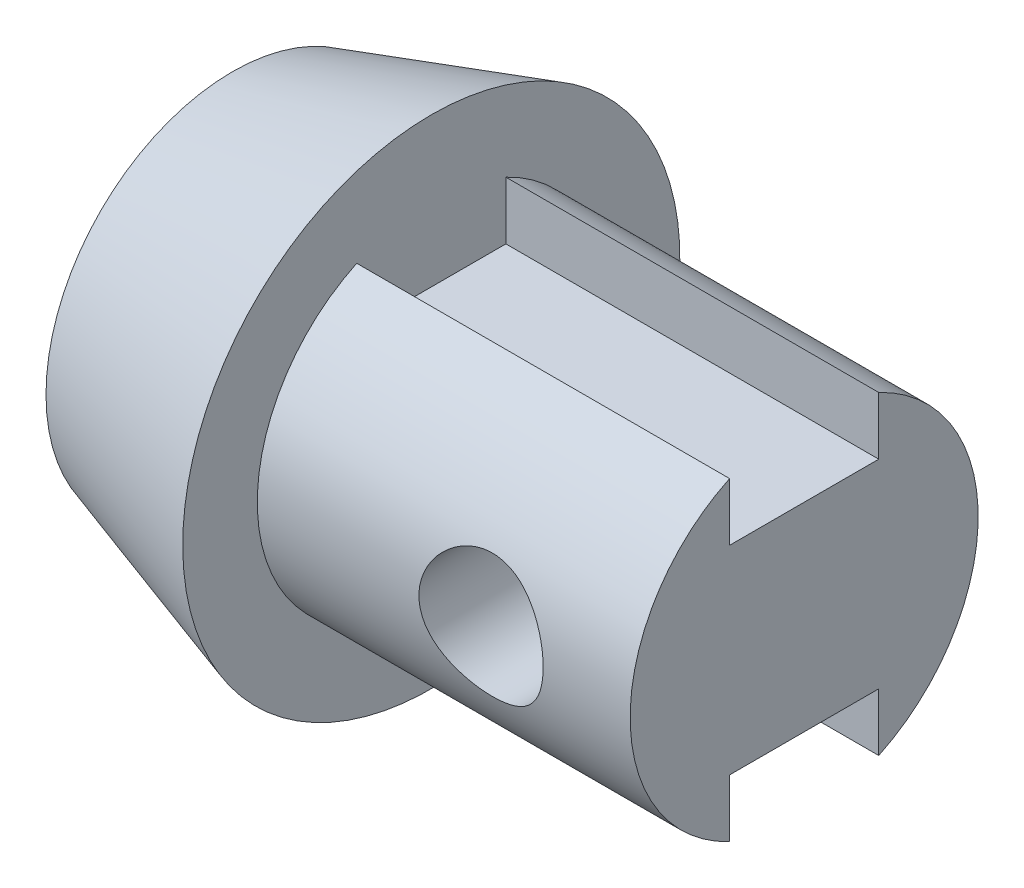
ISO-10303-21;
HEADER;
FILE_DESCRIPTION(('STEP AP214'),'2;1');
FILE_NAME('part.step','',(''),(''),'','','');
FILE_SCHEMA(('AUTOMOTIVE_DESIGN { 1 0 10303 214 1 1 1 1 }'));
ENDSEC;
DATA;
#1=APPLICATION_CONTEXT('core data for automotive mechanical design processes');
#2=APPLICATION_PROTOCOL_DEFINITION('international standard','automotive_design',2000,#1);
#3=PRODUCT_CONTEXT('',#1,'mechanical');
#4=PRODUCT('Part','Part','',(#3));
#5=PRODUCT_RELATED_PRODUCT_CATEGORY('part','',(#4));
#6=PRODUCT_DEFINITION_FORMATION('','',#4);
#7=PRODUCT_DEFINITION_CONTEXT('part definition',#1,'design');
#8=PRODUCT_DEFINITION('design','',#6,#7);
#9=PRODUCT_DEFINITION_SHAPE('','',#8);
#10=(LENGTH_UNIT() NAMED_UNIT(*) SI_UNIT(.MILLI.,.METRE.));
#11=(NAMED_UNIT(*) PLANE_ANGLE_UNIT() SI_UNIT($,.RADIAN.));
#12=(NAMED_UNIT(*) SI_UNIT($,.STERADIAN.) SOLID_ANGLE_UNIT());
#13=UNCERTAINTY_MEASURE_WITH_UNIT(LENGTH_MEASURE(1.E-05),#10,'distance_accuracy_value','');
#14=(GEOMETRIC_REPRESENTATION_CONTEXT(3) GLOBAL_UNCERTAINTY_ASSIGNED_CONTEXT((#13)) GLOBAL_UNIT_ASSIGNED_CONTEXT((#10,
#11,#12)) REPRESENTATION_CONTEXT('',''));
#15=CARTESIAN_POINT('',(0.,0.,0.));
#16=DIRECTION('',(0.,0.,1.));
#17=DIRECTION('',(1.,0.,0.));
#18=AXIS2_PLACEMENT_3D('',#15,#16,#17);
#19=CARTESIAN_POINT('',(23.,0.,0.));
#20=DIRECTION('',(1.,0.,0.));
#21=DIRECTION('',(0.,1.,0.));
#22=AXIS2_PLACEMENT_3D('',#19,#20,#21);
#23=CYLINDRICAL_SURFACE('',#22,7.);
#24=CARTESIAN_POINT('',(19.5,0.,-7.));
#25=CARTESIAN_POINT('',(19.5000028240419,-0.135839760518735,-7.0000020295295));
#26=CARTESIAN_POINT('',(19.4888932427672,-0.271659429947531,-6.99601056603649));
#27=CARTESIAN_POINT('',(19.4449087128079,-0.539264896606897,-6.98048404948616));
#28=CARTESIAN_POINT('',(19.4120345949352,-0.671050847614628,-6.96894928437749));
#29=CARTESIAN_POINT('',(19.3258148587325,-0.926692116674317,-6.93958109810981));
#30=CARTESIAN_POINT('',(19.2725064402801,-1.05056137145919,-6.92175912724346));
#31=CARTESIAN_POINT('',(19.1471112806324,-1.28759585298401,-6.88161078032354));
#32=CARTESIAN_POINT('',(19.075020040551,-1.40075850640075,-6.85928332539979));
#33=CARTESIAN_POINT('',(18.9111568678836,-1.61758802805346,-6.81147377429754));
#34=CARTESIAN_POINT('',(18.8187812689946,-1.72078015672851,-6.78590827445072));
#35=CARTESIAN_POINT('',(18.6182536362102,-1.9105819932243,-6.73493522536265));
#36=CARTESIAN_POINT('',(18.5100974162836,-1.99718728701346,-6.70952771990194));
#37=CARTESIAN_POINT('',(18.2766022072243,-2.15423735561842,-6.6608007016897));
#38=CARTESIAN_POINT('',(18.1508052564835,-2.2240352979483,-6.63758107761794));
#39=CARTESIAN_POINT('',(17.8882963352957,-2.34127572230003,-6.59714352451506));
#40=CARTESIAN_POINT('',(17.7515882854323,-2.38872619231546,-6.57992345154766));
#41=CARTESIAN_POINT('',(17.4765771637975,-2.45809130448528,-6.55432038222057));
#42=CARTESIAN_POINT('',(17.3385306930569,-2.48090519407331,-6.54562733379002));
#43=CARTESIAN_POINT('',(17.0603163681762,-2.5031615222748,-6.53715061879805));
#44=CARTESIAN_POINT('',(16.9201493074584,-2.50261249605974,-6.53736369856128));
#45=CARTESIAN_POINT('',(16.6496443449475,-2.4788507897233,-6.54640588297195));
#46=CARTESIAN_POINT('',(16.5191816470003,-2.45685161763648,-6.5547736366904));
#47=CARTESIAN_POINT('',(16.2639384728167,-2.3928085105506,-6.57842082174383));
#48=CARTESIAN_POINT('',(16.1391587753492,-2.35076183734614,-6.59370119723067));
#49=CARTESIAN_POINT('',(15.8962262542143,-2.247095668441,-6.62975170487814));
#50=CARTESIAN_POINT('',(15.7782303973415,-2.18514195933256,-6.65061447775042));
#51=CARTESIAN_POINT('',(15.5539436133503,-2.04365272690694,-6.69544469696369));
#52=CARTESIAN_POINT('',(15.4476564666926,-1.96411154980233,-6.71941314064672));
#53=CARTESIAN_POINT('',(15.2430404086289,-1.78403149047108,-6.76952498465894));
#54=CARTESIAN_POINT('',(15.1455821407508,-1.68251331515438,-6.79571223474351));
#55=CARTESIAN_POINT('',(14.9688283171652,-1.46426184534914,-6.84605473605516));
#56=CARTESIAN_POINT('',(14.8895350577012,-1.3475266301937,-6.87020973014028));
#57=CARTESIAN_POINT('',(14.7505193900608,-1.10010034292175,-6.91416998722002));
#58=CARTESIAN_POINT('',(14.6910617601102,-0.96924911242521,-6.93391532170415));
#59=CARTESIAN_POINT('',(14.5952841758396,-0.698523468127248,-6.96639167687355));
#60=CARTESIAN_POINT('',(14.5589549392374,-0.558652699053767,-6.97912551125635));
#61=CARTESIAN_POINT('',(14.5120808493404,-0.281205091813834,-6.99566202632136));
#62=CARTESIAN_POINT('',(14.5003618692543,-0.143850613169093,-6.99987103999093));
#63=CARTESIAN_POINT('',(14.4996548780098,0.130909371573393,-7.00012297890716));
#64=CARTESIAN_POINT('',(14.5106623730082,0.268314862212671,-6.99616751856457));
#65=CARTESIAN_POINT('',(14.5541861373216,0.534368698997769,-6.98080349995239));
#66=CARTESIAN_POINT('',(14.5859547557982,0.663155848081399,-6.96965417819419));
#67=CARTESIAN_POINT('',(14.6691365947361,0.913499444029994,-6.94128245796679));
#68=CARTESIAN_POINT('',(14.7205523658286,1.03505494970017,-6.9240592709991));
#69=CARTESIAN_POINT('',(14.8431588534016,1.27131790851501,-6.88465739573328));
#70=CARTESIAN_POINT('',(14.9148664804994,1.38573546298722,-6.86235262462324));
#71=CARTESIAN_POINT('',(15.0754274951075,1.60127936897371,-6.81528395513799));
#72=CARTESIAN_POINT('',(15.1642867647738,1.70240114063959,-6.79051921453452));
#73=CARTESIAN_POINT('',(15.3621296327289,1.89402292059753,-6.73966040960453));
#74=CARTESIAN_POINT('',(15.4719247130197,1.98368681906969,-6.71356479866296));
#75=CARTESIAN_POINT('',(15.7055412700044,2.14345525781598,-6.6642787599771));
#76=CARTESIAN_POINT('',(15.8293634311286,2.21355884309556,-6.64108847411014));
#77=CARTESIAN_POINT('',(16.0880648092361,2.33208686094212,-6.60040332956607));
#78=CARTESIAN_POINT('',(16.2229556705099,2.3804881075604,-6.58291456759544));
#79=CARTESIAN_POINT('',(16.4997601007201,2.45361419016748,-6.55601442004241));
#80=CARTESIAN_POINT('',(16.6416698206623,2.4783518546378,-6.54659865821929));
#81=CARTESIAN_POINT('',(16.919520479373,2.50236255506862,-6.53745596427834));
#82=CARTESIAN_POINT('',(17.0553232144244,2.50304426978182,-6.53719306756498));
#83=CARTESIAN_POINT('',(17.3249976706549,2.48247035008869,-6.54503319463772));
#84=CARTESIAN_POINT('',(17.4588695412482,2.46121642244208,-6.55313556754228));
#85=CARTESIAN_POINT('',(17.7175005853719,2.39843007607193,-6.57636700427785));
#86=CARTESIAN_POINT('',(17.8424040990058,2.35741961008936,-6.59131474248996));
#87=CARTESIAN_POINT('',(18.0836426818669,2.25672644338171,-6.62646329315119));
#88=CARTESIAN_POINT('',(18.1999756809442,2.19703924956895,-6.64666536944648));
#89=CARTESIAN_POINT('',(18.4269257499523,2.05730313071904,-6.69127230994833));
#90=CARTESIAN_POINT('',(18.5369880408629,1.97640371595173,-6.71583400336863));
#91=CARTESIAN_POINT('',(18.7424275046605,1.79790863011924,-6.76580411328317));
#92=CARTESIAN_POINT('',(18.837800220351,1.70030791033581,-6.79121278393859));
#93=CARTESIAN_POINT('',(19.0157219028166,1.48566252339524,-6.84145445667706));
#94=CARTESIAN_POINT('',(19.0974530397909,1.36791750616705,-6.86620367070764));
#95=CARTESIAN_POINT('',(19.2399076638379,1.11951131249464,-6.91104924401846));
#96=CARTESIAN_POINT('',(19.3006327402027,0.988851114158939,-6.93114595526313));
#97=CARTESIAN_POINT('',(19.3991403103086,0.717646336524986,-6.96446006180833));
#98=CARTESIAN_POINT('',(19.4368254081627,0.577062560467785,-6.97764821973896));
#99=CARTESIAN_POINT('',(19.4872488746388,0.290976881134822,-6.99541542277591));
#100=CARTESIAN_POINT('',(19.4999969756064,0.145476919097827,-6.99999782648543));
#101=CARTESIAN_POINT('',(19.5,0.,-7.));
#102=B_SPLINE_CURVE_WITH_KNOTS('',3,(#24,#25,#26,#27,#28,#29,#30,#31,#32,#33,#34,#35,#36,#37,
#38,#39,#40,#41,#42,#43,#44,#45,#46,#47,#48,#49,#50,#51,#52,#53,#54,#55,#56,#57,#58,#59,#60,#61,
#62,#63,#64,#65,#66,#67,#68,#69,#70,#71,#72,#73,#74,#75,#76,#77,#78,#79,#80,#81,#82,#83,#84,#85,
#86,#87,#88,#89,#90,#91,#92,#93,#94,#95,#96,#97,#98,#99,#100,#101),.UNSPECIFIED.,.T.,.F.,(4,2,2,
2,2,2,2,2,2,2,2,2,2,2,2,2,2,2,2,2,2,2,2,2,2,2,2,2,2,2,2,2,2,2,2,2,2,2,4),(0.,0.406983217142954,
0.813950899519932,1.22018120425629,1.62650889940498,2.04714572459521,2.46789433314937,
2.90289606780335,3.3377421950035,3.75611562378725,4.17433620956452,4.57019246497947,
4.96610280426156,5.36904149669469,5.77210990935867,6.19956653135137,6.62707715847137,
7.06008524763626,7.49291944485573,7.90458529912081,8.31616976000826,8.71369326802826,
9.11126840085792,9.52005856953123,9.92898918269314,10.3593838463852,10.7897995195909,
11.2206739431307,11.6513146487842,12.0566930957309,12.4620400035307,12.8572208236401,
13.2524967861626,13.6670344525245,14.0816976535747,14.5159343578492,14.9501382011315,
15.3861650682913,15.8220217300551),.UNSPECIFIED.);
#103=CARTESIAN_POINT('',(19.5,0.,-7.));
#104=VERTEX_POINT('',#103);
#105=EDGE_CURVE('E175',#104,#104,#102,.T.);
#106=ORIENTED_EDGE('',*,*,#105,.F.);
#107=EDGE_LOOP('',(#106));
#108=FACE_BOUND('',#107,.T.);
#109=CARTESIAN_POINT('',(8.,0.,0.));
#110=DIRECTION('',(1.,0.,0.));
#111=DIRECTION('',(0.,1.,0.));
#112=AXIS2_PLACEMENT_3D('',#109,#110,#111);
#113=CIRCLE('',#112,7.);
#114=CARTESIAN_POINT('',(8.,-6.32455532033676,-3.));
#115=VERTEX_POINT('',#114);
#116=CARTESIAN_POINT('',(8.,6.32455532033676,-3.));
#117=VERTEX_POINT('',#116);
#118=EDGE_CURVE('E141',#115,#117,#113,.T.);
#119=ORIENTED_EDGE('',*,*,#118,.T.);
#120=DIRECTION('',(1.,0.,0.));
#121=VECTOR('',#120,1.);
#122=CARTESIAN_POINT('',(1.29179606750063,6.32455532033676,-3.));
#123=LINE('',#122,#121);
#124=CARTESIAN_POINT('',(23.,6.32455532033676,-3.));
#125=VERTEX_POINT('',#124);
#126=EDGE_CURVE('E128',#117,#125,#123,.T.);
#127=ORIENTED_EDGE('',*,*,#126,.T.);
#128=CARTESIAN_POINT('',(23.,0.,0.));
#129=DIRECTION('',(1.,0.,0.));
#130=DIRECTION('',(0.,1.,0.));
#131=AXIS2_PLACEMENT_3D('',#128,#129,#130);
#132=CIRCLE('',#131,7.);
#133=CARTESIAN_POINT('',(23.,-6.32455532033676,-3.));
#134=VERTEX_POINT('',#133);
#135=EDGE_CURVE('E143',#134,#125,#132,.T.);
#136=ORIENTED_EDGE('',*,*,#135,.F.);
#137=DIRECTION('',(1.,0.,0.));
#138=VECTOR('',#137,1.);
#139=CARTESIAN_POINT('',(1.29179606750063,-6.32455532033676,-3.));
#140=LINE('',#139,#138);
#141=EDGE_CURVE('E190',#115,#134,#140,.T.);
#142=ORIENTED_EDGE('',*,*,#141,.F.);
#143=EDGE_LOOP('',(#119,#127,#136,#142));
#144=FACE_BOUND('',#143,.T.);
#145=ADVANCED_FACE('F44',(#108,#144),#23,.T.);
#146=CARTESIAN_POINT('',(23.,7.,0.));
#147=DIRECTION('',(1.,0.,0.));
#148=DIRECTION('',(0.,1.,0.));
#149=AXIS2_PLACEMENT_3D('',#146,#147,#148);
#150=PLANE('',#149);
#151=DIRECTION('',(0.,-1.,0.));
#152=VECTOR('',#151,1.);
#153=CARTESIAN_POINT('',(23.,7.,3.));
#154=LINE('',#153,#152);
#155=CARTESIAN_POINT('',(23.,6.32455532033676,3.));
#156=VERTEX_POINT('',#155);
#157=CARTESIAN_POINT('',(23.,4.,3.));
#158=VERTEX_POINT('',#157);
#159=EDGE_CURVE('E165',#156,#158,#154,.T.);
#160=ORIENTED_EDGE('',*,*,#159,.F.);
#161=CARTESIAN_POINT('',(23.,0.,0.));
#162=DIRECTION('',(1.,0.,0.));
#163=DIRECTION('',(0.,1.,0.));
#164=AXIS2_PLACEMENT_3D('',#161,#162,#163);
#165=CIRCLE('',#164,7.);
#166=CARTESIAN_POINT('',(23.,-6.32455532033676,3.));
#167=VERTEX_POINT('',#166);
#168=EDGE_CURVE('E153',#156,#167,#165,.T.);
#169=ORIENTED_EDGE('',*,*,#168,.T.);
#170=DIRECTION('',(0.,1.,0.));
#171=VECTOR('',#170,1.);
#172=CARTESIAN_POINT('',(23.,7.,3.));
#173=LINE('',#172,#171);
#174=CARTESIAN_POINT('',(23.,-4.,3.));
#175=VERTEX_POINT('',#174);
#176=EDGE_CURVE('E93',#167,#175,#173,.T.);
#177=ORIENTED_EDGE('',*,*,#176,.T.);
#178=DIRECTION('',(0.,0.,1.));
#179=VECTOR('',#178,1.);
#180=CARTESIAN_POINT('',(23.,-4.,0.));
#181=LINE('',#180,#179);
#182=CARTESIAN_POINT('',(23.,-4.,-3.));
#183=VERTEX_POINT('',#182);
#184=EDGE_CURVE('E166',#175,#183,#181,.F.);
#185=ORIENTED_EDGE('',*,*,#184,.T.);
#186=DIRECTION('',(0.,1.,0.));
#187=VECTOR('',#186,1.);
#188=CARTESIAN_POINT('',(23.,7.,-3.));
#189=LINE('',#188,#187);
#190=EDGE_CURVE('E151',#134,#183,#189,.T.);
#191=ORIENTED_EDGE('',*,*,#190,.F.);
#192=ORIENTED_EDGE('',*,*,#135,.T.);
#193=DIRECTION('',(0.,1.,0.));
#194=VECTOR('',#193,1.);
#195=CARTESIAN_POINT('',(23.,7.,-3.));
#196=LINE('',#195,#194);
#197=CARTESIAN_POINT('',(23.,4.,-3.));
#198=VERTEX_POINT('',#197);
#199=EDGE_CURVE('E130',#125,#198,#196,.F.);
#200=ORIENTED_EDGE('',*,*,#199,.T.);
#201=DIRECTION('',(0.,0.,-1.));
#202=VECTOR('',#201,1.);
#203=CARTESIAN_POINT('',(23.,4.,0.));
#204=LINE('',#203,#202);
#205=EDGE_CURVE('E68',#158,#198,#204,.T.);
#206=ORIENTED_EDGE('',*,*,#205,.F.);
#207=EDGE_LOOP('',(#160,#169,#177,#185,#191,#192,#200,#206));
#208=FACE_BOUND('',#207,.T.);
#209=ADVANCED_FACE('F149',(#208),#150,.T.);
#210=CARTESIAN_POINT('',(0.,0.,0.));
#211=DIRECTION('',(-1.,0.,0.));
#212=DIRECTION('',(0.,-1.,0.));
#213=AXIS2_PLACEMENT_3D('',#210,#211,#212);
#214=PLANE('',#213);
#215=CARTESIAN_POINT('',(0.,0.,0.));
#216=DIRECTION('',(1.,0.,0.));
#217=DIRECTION('',(0.,1.,0.));
#218=AXIS2_PLACEMENT_3D('',#215,#216,#217);
#219=CIRCLE('',#218,7.5);
#220=CARTESIAN_POINT('',(0.,7.5,0.));
#221=VERTEX_POINT('',#220);
#222=EDGE_CURVE('E11',#221,#221,#219,.T.);
#223=ORIENTED_EDGE('',*,*,#222,.F.);
#224=EDGE_LOOP('',(#223));
#225=FACE_BOUND('',#224,.T.);
#226=ADVANCED_FACE('F50',(#225),#214,.T.);
#227=CARTESIAN_POINT('',(8.,0.,0.));
#228=DIRECTION('',(1.,0.,0.));
#229=DIRECTION('',(0.,1.,0.));
#230=AXIS2_PLACEMENT_3D('',#227,#228,#229);
#231=CONICAL_SURFACE('',#230,10.,0.302884868374971);
#232=ORIENTED_EDGE('',*,*,#222,.T.);
#233=EDGE_LOOP('',(#232));
#234=FACE_BOUND('',#233,.T.);
#235=CARTESIAN_POINT('',(8.,0.,0.));
#236=DIRECTION('',(1.,0.,0.));
#237=DIRECTION('',(0.,1.,0.));
#238=AXIS2_PLACEMENT_3D('',#235,#236,#237);
#239=CIRCLE('',#238,10.);
#240=CARTESIAN_POINT('',(8.,10.,0.));
#241=VERTEX_POINT('',#240);
#242=EDGE_CURVE('E62',#241,#241,#239,.T.);
#243=ORIENTED_EDGE('',*,*,#242,.F.);
#244=EDGE_LOOP('',(#243));
#245=FACE_BOUND('',#244,.T.);
#246=ADVANCED_FACE('F251',(#234,#245),#231,.T.);
#247=CARTESIAN_POINT('',(8.,10.,0.));
#248=DIRECTION('',(1.,0.,0.));
#249=DIRECTION('',(0.,1.,0.));
#250=AXIS2_PLACEMENT_3D('',#247,#248,#249);
#251=PLANE('',#250);
#252=ORIENTED_EDGE('',*,*,#242,.T.);
#253=EDGE_LOOP('',(#252));
#254=FACE_BOUND('',#253,.T.);
#255=CARTESIAN_POINT('',(8.,6.32455532033676,3.));
#256=VERTEX_POINT('',#255);
#257=CARTESIAN_POINT('',(8.,-6.32455532033676,3.));
#258=VERTEX_POINT('',#257);
#259=EDGE_CURVE('E178',#256,#258,#113,.T.);
#260=ORIENTED_EDGE('',*,*,#259,.F.);
#261=DIRECTION('',(0.,1.,0.));
#262=VECTOR('',#261,1.);
#263=CARTESIAN_POINT('',(8.,0.,3.));
#264=LINE('',#263,#262);
#265=CARTESIAN_POINT('',(8.,4.,3.));
#266=VERTEX_POINT('',#265);
#267=EDGE_CURVE('E157',#266,#256,#264,.T.);
#268=ORIENTED_EDGE('',*,*,#267,.F.);
#269=DIRECTION('',(0.,0.,1.));
#270=VECTOR('',#269,1.);
#271=CARTESIAN_POINT('',(8.,4.,0.));
#272=LINE('',#271,#270);
#273=CARTESIAN_POINT('',(8.,4.,-3.));
#274=VERTEX_POINT('',#273);
#275=EDGE_CURVE('E152',#274,#266,#272,.T.);
#276=ORIENTED_EDGE('',*,*,#275,.F.);
#277=DIRECTION('',(0.,1.,0.));
#278=VECTOR('',#277,1.);
#279=CARTESIAN_POINT('',(8.,0.,-3.));
#280=LINE('',#279,#278);
#281=EDGE_CURVE('E121',#274,#117,#280,.T.);
#282=ORIENTED_EDGE('',*,*,#281,.T.);
#283=ORIENTED_EDGE('',*,*,#118,.F.);
#284=DIRECTION('',(0.,-1.,0.));
#285=VECTOR('',#284,1.);
#286=CARTESIAN_POINT('',(8.,0.,-3.));
#287=LINE('',#286,#285);
#288=CARTESIAN_POINT('',(8.,-4.,-3.));
#289=VERTEX_POINT('',#288);
#290=EDGE_CURVE('E205',#289,#115,#287,.T.);
#291=ORIENTED_EDGE('',*,*,#290,.F.);
#292=DIRECTION('',(0.,0.,1.));
#293=VECTOR('',#292,1.);
#294=CARTESIAN_POINT('',(8.,-4.,0.));
#295=LINE('',#294,#293);
#296=CARTESIAN_POINT('',(8.,-4.,3.));
#297=VERTEX_POINT('',#296);
#298=EDGE_CURVE('E167',#289,#297,#295,.T.);
#299=ORIENTED_EDGE('',*,*,#298,.T.);
#300=DIRECTION('',(0.,-1.,0.));
#301=VECTOR('',#300,1.);
#302=CARTESIAN_POINT('',(8.,0.,3.00000000000001));
#303=LINE('',#302,#301);
#304=EDGE_CURVE('E187',#297,#258,#303,.T.);
#305=ORIENTED_EDGE('',*,*,#304,.T.);
#306=EDGE_LOOP('',(#260,#268,#276,#282,#283,#291,#299,#305));
#307=FACE_BOUND('',#306,.T.);
#308=ADVANCED_FACE('F261',(#254,#307),#251,.T.);
#309=CARTESIAN_POINT('',(19.5,0.,7.));
#310=CARTESIAN_POINT('',(19.5000028240419,0.135839760518735,7.0000020295295));
#311=CARTESIAN_POINT('',(19.4888932427672,0.271659429947531,6.99601056603649));
#312=CARTESIAN_POINT('',(19.4449087128079,0.539264896606897,6.98048404948616));
#313=CARTESIAN_POINT('',(19.4120345949352,0.671050847614628,6.96894928437749));
#314=CARTESIAN_POINT('',(19.3258148587325,0.926692116674317,6.93958109810981));
#315=CARTESIAN_POINT('',(19.2725064402801,1.05056137145919,6.92175912724346));
#316=CARTESIAN_POINT('',(19.1471112806324,1.28759585298401,6.88161078032354));
#317=CARTESIAN_POINT('',(19.075020040551,1.40075850640075,6.85928332539979));
#318=CARTESIAN_POINT('',(18.9111568678836,1.61758802805346,6.81147377429754));
#319=CARTESIAN_POINT('',(18.8187812689946,1.72078015672851,6.78590827445072));
#320=CARTESIAN_POINT('',(18.6182536362102,1.9105819932243,6.73493522536265));
#321=CARTESIAN_POINT('',(18.5100974162836,1.99718728701346,6.70952771990194));
#322=CARTESIAN_POINT('',(18.2766022072243,2.15423735561842,6.6608007016897));
#323=CARTESIAN_POINT('',(18.1508052564835,2.2240352979483,6.63758107761794));
#324=CARTESIAN_POINT('',(17.8882963352957,2.34127572230003,6.59714352451506));
#325=CARTESIAN_POINT('',(17.7515882854323,2.38872619231546,6.57992345154766));
#326=CARTESIAN_POINT('',(17.4765771637975,2.45809130448528,6.55432038222057));
#327=CARTESIAN_POINT('',(17.3385306930569,2.48090519407331,6.54562733379002));
#328=CARTESIAN_POINT('',(17.0603163681762,2.5031615222748,6.53715061879805));
#329=CARTESIAN_POINT('',(16.9201493074584,2.50261249605974,6.53736369856128));
#330=CARTESIAN_POINT('',(16.6496443449475,2.4788507897233,6.54640588297195));
#331=CARTESIAN_POINT('',(16.5191816470003,2.45685161763648,6.5547736366904));
#332=CARTESIAN_POINT('',(16.2639384728167,2.3928085105506,6.57842082174383));
#333=CARTESIAN_POINT('',(16.1391587753492,2.35076183734614,6.59370119723067));
#334=CARTESIAN_POINT('',(15.8962262542143,2.247095668441,6.62975170487814));
#335=CARTESIAN_POINT('',(15.7782303973415,2.18514195933256,6.65061447775042));
#336=CARTESIAN_POINT('',(15.5539436133503,2.04365272690694,6.69544469696369));
#337=CARTESIAN_POINT('',(15.4476564666926,1.96411154980233,6.71941314064672));
#338=CARTESIAN_POINT('',(15.2430404086289,1.78403149047108,6.76952498465894));
#339=CARTESIAN_POINT('',(15.1455821407508,1.68251331515438,6.79571223474351));
#340=CARTESIAN_POINT('',(14.9688283171652,1.46426184534914,6.84605473605516));
#341=CARTESIAN_POINT('',(14.8895350577012,1.3475266301937,6.87020973014028));
#342=CARTESIAN_POINT('',(14.7505193900608,1.10010034292175,6.91416998722002));
#343=CARTESIAN_POINT('',(14.6910617601102,0.96924911242521,6.93391532170415));
#344=CARTESIAN_POINT('',(14.5952841758396,0.698523468127248,6.96639167687355));
#345=CARTESIAN_POINT('',(14.5589549392374,0.558652699053767,6.97912551125635));
#346=CARTESIAN_POINT('',(14.5120808493404,0.281205091813834,6.99566202632136));
#347=CARTESIAN_POINT('',(14.5003618692543,0.143850613169093,6.99987103999093));
#348=CARTESIAN_POINT('',(14.4996548780098,-0.130909371573393,7.00012297890716));
#349=CARTESIAN_POINT('',(14.5106623730082,-0.268314862212671,6.99616751856457));
#350=CARTESIAN_POINT('',(14.5541861373216,-0.534368698997769,6.98080349995239));
#351=CARTESIAN_POINT('',(14.5859547557982,-0.663155848081399,6.96965417819419));
#352=CARTESIAN_POINT('',(14.6691365947361,-0.913499444029994,6.94128245796679));
#353=CARTESIAN_POINT('',(14.7205523658286,-1.03505494970017,6.9240592709991));
#354=CARTESIAN_POINT('',(14.8431588534016,-1.27131790851501,6.88465739573328));
#355=CARTESIAN_POINT('',(14.9148664804994,-1.38573546298722,6.86235262462324));
#356=CARTESIAN_POINT('',(15.0754274951075,-1.60127936897371,6.81528395513799));
#357=CARTESIAN_POINT('',(15.1642867647738,-1.70240114063959,6.79051921453452));
#358=CARTESIAN_POINT('',(15.3621296327289,-1.89402292059753,6.73966040960453));
#359=CARTESIAN_POINT('',(15.4719247130197,-1.98368681906969,6.71356479866296));
#360=CARTESIAN_POINT('',(15.7055412700044,-2.14345525781598,6.6642787599771));
#361=CARTESIAN_POINT('',(15.8293634311286,-2.21355884309556,6.64108847411014));
#362=CARTESIAN_POINT('',(16.0880648092361,-2.33208686094212,6.60040332956607));
#363=CARTESIAN_POINT('',(16.2229556705099,-2.3804881075604,6.58291456759544));
#364=CARTESIAN_POINT('',(16.4997601007201,-2.45361419016748,6.55601442004241));
#365=CARTESIAN_POINT('',(16.6416698206623,-2.4783518546378,6.54659865821929));
#366=CARTESIAN_POINT('',(16.919520479373,-2.50236255506862,6.53745596427834));
#367=CARTESIAN_POINT('',(17.0553232144244,-2.50304426978182,6.53719306756498));
#368=CARTESIAN_POINT('',(17.3249976706549,-2.48247035008869,6.54503319463772));
#369=CARTESIAN_POINT('',(17.4588695412482,-2.46121642244208,6.55313556754228));
#370=CARTESIAN_POINT('',(17.7175005853719,-2.39843007607193,6.57636700427785));
#371=CARTESIAN_POINT('',(17.8424040990058,-2.35741961008936,6.59131474248996));
#372=CARTESIAN_POINT('',(18.0836426818669,-2.25672644338171,6.62646329315119));
#373=CARTESIAN_POINT('',(18.1999756809442,-2.19703924956895,6.64666536944648));
#374=CARTESIAN_POINT('',(18.4269257499523,-2.05730313071904,6.69127230994833));
#375=CARTESIAN_POINT('',(18.5369880408629,-1.97640371595173,6.71583400336863));
#376=CARTESIAN_POINT('',(18.7424275046605,-1.79790863011924,6.76580411328317));
#377=CARTESIAN_POINT('',(18.837800220351,-1.70030791033581,6.79121278393859));
#378=CARTESIAN_POINT('',(19.0157219028166,-1.48566252339524,6.84145445667706));
#379=CARTESIAN_POINT('',(19.0974530397909,-1.36791750616705,6.86620367070764));
#380=CARTESIAN_POINT('',(19.2399076638379,-1.11951131249464,6.91104924401846));
#381=CARTESIAN_POINT('',(19.3006327402027,-0.988851114158939,6.93114595526313));
#382=CARTESIAN_POINT('',(19.3991403103086,-0.717646336524986,6.96446006180833));
#383=CARTESIAN_POINT('',(19.4368254081627,-0.577062560467785,6.97764821973896));
#384=CARTESIAN_POINT('',(19.4872488746388,-0.290976881134822,6.99541542277591));
#385=CARTESIAN_POINT('',(19.4999969756064,-0.145476919097827,6.99999782648543));
#386=CARTESIAN_POINT('',(19.5,0.,7.));
#387=B_SPLINE_CURVE_WITH_KNOTS('',3,(#309,#310,#311,#312,#313,#314,#315,#316,#317,#318,#319,
#320,#321,#322,#323,#324,#325,#326,#327,#328,#329,#330,#331,#332,#333,#334,#335,#336,#337,#338,
#339,#340,#341,#342,#343,#344,#345,#346,#347,#348,#349,#350,#351,#352,#353,#354,#355,#356,#357,
#358,#359,#360,#361,#362,#363,#364,#365,#366,#367,#368,#369,#370,#371,#372,#373,#374,#375,#376,
#377,#378,#379,#380,#381,#382,#383,#384,#385,#386),.UNSPECIFIED.,.T.,.F.,(4,2,2,2,2,2,2,2,2,2,2,
2,2,2,2,2,2,2,2,2,2,2,2,2,2,2,2,2,2,2,2,2,2,2,2,2,2,2,4),(0.,0.406983217142954,
0.813950899519932,1.22018120425629,1.62650889940498,2.04714572459521,2.46789433314937,
2.90289606780335,3.3377421950035,3.75611562378725,4.17433620956452,4.57019246497947,
4.96610280426156,5.36904149669469,5.77210990935867,6.19956653135137,6.62707715847137,
7.06008524763626,7.49291944485573,7.90458529912081,8.31616976000826,8.71369326802826,
9.11126840085792,9.52005856953123,9.92898918269314,10.3593838463852,10.7897995195909,
11.2206739431307,11.6513146487842,12.0566930957309,12.4620400035307,12.8572208236401,
13.2524967861626,13.6670344525245,14.0816976535747,14.5159343578492,14.9501382011315,
15.3861650682913,15.8220217300551),.UNSPECIFIED.);
#388=CARTESIAN_POINT('',(19.5,0.,7.));
#389=VERTEX_POINT('',#388);
#390=EDGE_CURVE('E47',#389,#389,#387,.T.);
#391=ORIENTED_EDGE('',*,*,#390,.F.);
#392=EDGE_LOOP('',(#391));
#393=FACE_BOUND('',#392,.T.);
#394=DIRECTION('',(1.,0.,0.));
#395=VECTOR('',#394,1.);
#396=CARTESIAN_POINT('',(1.29179606750063,6.32455532033676,3.));
#397=LINE('',#396,#395);
#398=EDGE_CURVE('E144',#256,#156,#397,.T.);
#399=ORIENTED_EDGE('',*,*,#398,.F.);
#400=ORIENTED_EDGE('',*,*,#259,.T.);
#401=DIRECTION('',(1.,0.,0.));
#402=VECTOR('',#401,1.);
#403=CARTESIAN_POINT('',(1.29179606750063,-6.32455532033676,3.));
#404=LINE('',#403,#402);
#405=EDGE_CURVE('E188',#258,#167,#404,.T.);
#406=ORIENTED_EDGE('',*,*,#405,.T.);
#407=ORIENTED_EDGE('',*,*,#168,.F.);
#408=EDGE_LOOP('',(#399,#400,#406,#407));
#409=FACE_BOUND('',#408,.T.);
#410=ADVANCED_FACE('F218',(#393,#409),#23,.T.);
#411=CARTESIAN_POINT('',(1.29179606750063,0.,3.00000000000001));
#412=DIRECTION('',(0.,0.,-1.));
#413=DIRECTION('',(0.,1.,0.));
#414=AXIS2_PLACEMENT_3D('',#411,#412,#413);
#415=PLANE('',#414);
#416=DIRECTION('',(1.,0.,0.));
#417=VECTOR('',#416,1.);
#418=CARTESIAN_POINT('',(1.29179606750063,-4.,3.));
#419=LINE('',#418,#417);
#420=EDGE_CURVE('E104',#297,#175,#419,.T.);
#421=ORIENTED_EDGE('',*,*,#420,.T.);
#422=ORIENTED_EDGE('',*,*,#176,.F.);
#423=ORIENTED_EDGE('',*,*,#405,.F.);
#424=ORIENTED_EDGE('',*,*,#304,.F.);
#425=EDGE_LOOP('',(#421,#422,#423,#424));
#426=FACE_BOUND('',#425,.T.);
#427=ADVANCED_FACE('F245',(#426),#415,.T.);
#428=CARTESIAN_POINT('',(1.29179606750063,0.,-3.));
#429=DIRECTION('',(0.,0.,-1.));
#430=DIRECTION('',(-1.,0.,0.));
#431=AXIS2_PLACEMENT_3D('',#428,#429,#430);
#432=PLANE('',#431);
#433=ORIENTED_EDGE('',*,*,#290,.T.);
#434=ORIENTED_EDGE('',*,*,#141,.T.);
#435=ORIENTED_EDGE('',*,*,#190,.T.);
#436=DIRECTION('',(1.,0.,0.));
#437=VECTOR('',#436,1.);
#438=CARTESIAN_POINT('',(1.29179606750063,-4.,-3.));
#439=LINE('',#438,#437);
#440=EDGE_CURVE('E101',#289,#183,#439,.T.);
#441=ORIENTED_EDGE('',*,*,#440,.F.);
#442=EDGE_LOOP('',(#433,#434,#435,#441));
#443=FACE_BOUND('',#442,.T.);
#444=ADVANCED_FACE('F239',(#443),#432,.F.);
#445=CARTESIAN_POINT('',(1.29179606750063,-4.,0.));
#446=DIRECTION('',(0.,-1.,0.));
#447=DIRECTION('',(0.,0.,-1.));
#448=AXIS2_PLACEMENT_3D('',#445,#446,#447);
#449=PLANE('',#448);
#450=ORIENTED_EDGE('',*,*,#440,.T.);
#451=ORIENTED_EDGE('',*,*,#184,.F.);
#452=ORIENTED_EDGE('',*,*,#420,.F.);
#453=ORIENTED_EDGE('',*,*,#298,.F.);
#454=EDGE_LOOP('',(#450,#451,#452,#453));
#455=FACE_BOUND('',#454,.T.);
#456=ADVANCED_FACE('F240',(#455),#449,.T.);
#457=CARTESIAN_POINT('',(1.29179606750063,0.,3.));
#458=DIRECTION('',(0.,0.,1.));
#459=DIRECTION('',(0.,-1.,0.));
#460=AXIS2_PLACEMENT_3D('',#457,#458,#459);
#461=PLANE('',#460);
#462=ORIENTED_EDGE('',*,*,#267,.T.);
#463=ORIENTED_EDGE('',*,*,#398,.T.);
#464=ORIENTED_EDGE('',*,*,#159,.T.);
#465=DIRECTION('',(1.,0.,0.));
#466=VECTOR('',#465,1.);
#467=CARTESIAN_POINT('',(1.29179606750063,4.,3.));
#468=LINE('',#467,#466);
#469=EDGE_CURVE('E137',#266,#158,#468,.T.);
#470=ORIENTED_EDGE('',*,*,#469,.F.);
#471=EDGE_LOOP('',(#462,#463,#464,#470));
#472=FACE_BOUND('',#471,.T.);
#473=ADVANCED_FACE('F235',(#472),#461,.F.);
#474=CARTESIAN_POINT('',(1.29179606750063,0.,-3.));
#475=DIRECTION('',(0.,0.,1.));
#476=DIRECTION('',(0.,-1.,0.));
#477=AXIS2_PLACEMENT_3D('',#474,#475,#476);
#478=PLANE('',#477);
#479=DIRECTION('',(1.,0.,0.));
#480=VECTOR('',#479,1.);
#481=CARTESIAN_POINT('',(1.29179606750063,4.,-3.));
#482=LINE('',#481,#480);
#483=EDGE_CURVE('E135',#274,#198,#482,.T.);
#484=ORIENTED_EDGE('',*,*,#483,.T.);
#485=ORIENTED_EDGE('',*,*,#199,.F.);
#486=ORIENTED_EDGE('',*,*,#126,.F.);
#487=ORIENTED_EDGE('',*,*,#281,.F.);
#488=EDGE_LOOP('',(#484,#485,#486,#487));
#489=FACE_BOUND('',#488,.T.);
#490=ADVANCED_FACE('F129',(#489),#478,.T.);
#491=CARTESIAN_POINT('',(1.29179606750063,4.,0.));
#492=DIRECTION('',(0.,-1.,0.));
#493=DIRECTION('',(1.,0.,0.));
#494=AXIS2_PLACEMENT_3D('',#491,#492,#493);
#495=PLANE('',#494);
#496=ORIENTED_EDGE('',*,*,#275,.T.);
#497=ORIENTED_EDGE('',*,*,#469,.T.);
#498=ORIENTED_EDGE('',*,*,#205,.T.);
#499=ORIENTED_EDGE('',*,*,#483,.F.);
#500=EDGE_LOOP('',(#496,#497,#498,#499));
#501=FACE_BOUND('',#500,.T.);
#502=ADVANCED_FACE('F230',(#501),#495,.F.);
#503=CARTESIAN_POINT('',(17.,0.,-10.));
#504=DIRECTION('',(0.,0.,1.));
#505=DIRECTION('',(1.,0.,0.));
#506=AXIS2_PLACEMENT_3D('',#503,#504,#505);
#507=CYLINDRICAL_SURFACE('',#506,2.5);
#508=ORIENTED_EDGE('',*,*,#105,.T.);
#509=EDGE_LOOP('',(#508));
#510=FACE_BOUND('',#509,.T.);
#511=ORIENTED_EDGE('',*,*,#390,.T.);
#512=EDGE_LOOP('',(#511));
#513=FACE_BOUND('',#512,.T.);
#514=ADVANCED_FACE('F224',(#510,#513),#507,.F.);
#515=CLOSED_SHELL('',(#145,#209,#226,#246,#308,#410,#427,#444,#456,#473,#490,#502,#514));
#516=MANIFOLD_SOLID_BREP('B2',#515);
#517=ADVANCED_BREP_SHAPE_REPRESENTATION('',(#18,#516),#14);
#518=SHAPE_DEFINITION_REPRESENTATION(#9,#517);
ENDSEC;
END-ISO-10303-21;
